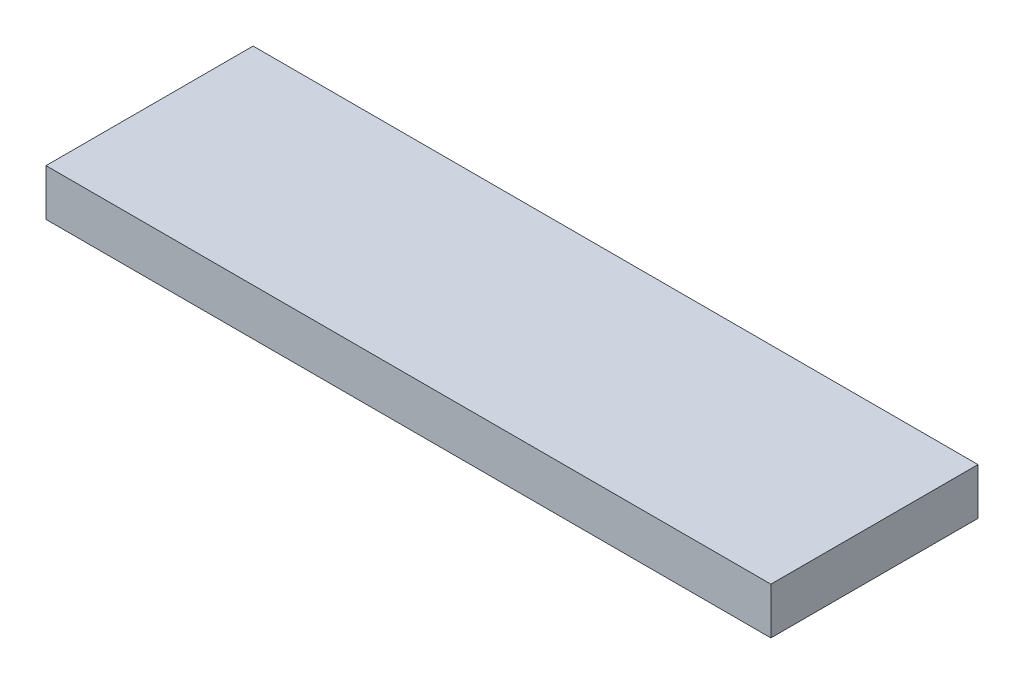
ISO-10303-21;
HEADER;
FILE_DESCRIPTION(('STEP AP214'),'2;1');
FILE_NAME('part.step','',(''),(''),'','','');
FILE_SCHEMA(('AUTOMOTIVE_DESIGN { 1 0 10303 214 1 1 1 1 }'));
ENDSEC;
DATA;
#1=APPLICATION_CONTEXT('core data for automotive mechanical design processes');
#2=APPLICATION_PROTOCOL_DEFINITION('international standard','automotive_design',2000,#1);
#3=PRODUCT_CONTEXT('',#1,'mechanical');
#4=PRODUCT('Part','Part','',(#3));
#5=PRODUCT_RELATED_PRODUCT_CATEGORY('part','',(#4));
#6=PRODUCT_DEFINITION_FORMATION('','',#4);
#7=PRODUCT_DEFINITION_CONTEXT('part definition',#1,'design');
#8=PRODUCT_DEFINITION('design','',#6,#7);
#9=PRODUCT_DEFINITION_SHAPE('','',#8);
#10=(LENGTH_UNIT() NAMED_UNIT(*) SI_UNIT(.MILLI.,.METRE.));
#11=(NAMED_UNIT(*) PLANE_ANGLE_UNIT() SI_UNIT($,.RADIAN.));
#12=(NAMED_UNIT(*) SI_UNIT($,.STERADIAN.) SOLID_ANGLE_UNIT());
#13=UNCERTAINTY_MEASURE_WITH_UNIT(LENGTH_MEASURE(1.E-05),#10,'distance_accuracy_value','');
#14=(GEOMETRIC_REPRESENTATION_CONTEXT(3) GLOBAL_UNCERTAINTY_ASSIGNED_CONTEXT((#13)) GLOBAL_UNIT_ASSIGNED_CONTEXT((#10,
#11,#12)) REPRESENTATION_CONTEXT('',''));
#15=CARTESIAN_POINT('',(0.,0.,0.));
#16=DIRECTION('',(0.,0.,1.));
#17=DIRECTION('',(1.,0.,0.));
#18=AXIS2_PLACEMENT_3D('',#15,#16,#17);
#19=CARTESIAN_POINT('',(35.,4.5,-10.));
#20=DIRECTION('',(-1.,0.,0.));
#21=DIRECTION('',(0.,0.,1.));
#22=AXIS2_PLACEMENT_3D('',#19,#20,#21);
#23=PLANE('',#22);
#24=DIRECTION('',(0.,0.,-1.));
#25=VECTOR('',#24,1.);
#26=CARTESIAN_POINT('',(35.,0.,-10.));
#27=LINE('',#26,#25);
#28=CARTESIAN_POINT('',(35.,0.,10.));
#29=VERTEX_POINT('',#28);
#30=CARTESIAN_POINT('',(35.,0.,-10.));
#31=VERTEX_POINT('',#30);
#32=EDGE_CURVE('E96',#29,#31,#27,.T.);
#33=ORIENTED_EDGE('',*,*,#32,.T.);
#34=DIRECTION('',(0.,-1.,0.));
#35=VECTOR('',#34,1.);
#36=CARTESIAN_POINT('',(35.,4.5,-10.));
#37=LINE('',#36,#35);
#38=CARTESIAN_POINT('',(35.,4.5,-10.));
#39=VERTEX_POINT('',#38);
#40=EDGE_CURVE('E11',#39,#31,#37,.T.);
#41=ORIENTED_EDGE('',*,*,#40,.F.);
#42=DIRECTION('',(0.,0.,-1.));
#43=VECTOR('',#42,1.);
#44=CARTESIAN_POINT('',(35.,4.5,-10.));
#45=LINE('',#44,#43);
#46=CARTESIAN_POINT('',(35.,4.5,10.));
#47=VERTEX_POINT('',#46);
#48=EDGE_CURVE('E84',#47,#39,#45,.T.);
#49=ORIENTED_EDGE('',*,*,#48,.F.);
#50=DIRECTION('',(0.,-1.,0.));
#51=VECTOR('',#50,1.);
#52=CARTESIAN_POINT('',(35.,4.5,10.));
#53=LINE('',#52,#51);
#54=EDGE_CURVE('E92',#47,#29,#53,.T.);
#55=ORIENTED_EDGE('',*,*,#54,.T.);
#56=EDGE_LOOP('',(#33,#41,#49,#55));
#57=FACE_BOUND('',#56,.T.);
#58=ADVANCED_FACE('F33',(#57),#23,.F.);
#59=CARTESIAN_POINT('',(-35.,4.5,-10.));
#60=DIRECTION('',(0.,0.,1.));
#61=DIRECTION('',(1.,0.,0.));
#62=AXIS2_PLACEMENT_3D('',#59,#60,#61);
#63=PLANE('',#62);
#64=DIRECTION('',(-1.,0.,0.));
#65=VECTOR('',#64,1.);
#66=CARTESIAN_POINT('',(-35.,0.,-10.));
#67=LINE('',#66,#65);
#68=CARTESIAN_POINT('',(-35.,0.,-10.));
#69=VERTEX_POINT('',#68);
#70=EDGE_CURVE('E88',#31,#69,#67,.T.);
#71=ORIENTED_EDGE('',*,*,#70,.T.);
#72=DIRECTION('',(0.,-1.,0.));
#73=VECTOR('',#72,1.);
#74=CARTESIAN_POINT('',(-35.,4.5,-10.));
#75=LINE('',#74,#73);
#76=CARTESIAN_POINT('',(-35.,4.5,-10.));
#77=VERTEX_POINT('',#76);
#78=EDGE_CURVE('E41',#77,#69,#75,.T.);
#79=ORIENTED_EDGE('',*,*,#78,.F.);
#80=DIRECTION('',(-1.,0.,0.));
#81=VECTOR('',#80,1.);
#82=CARTESIAN_POINT('',(-35.,4.5,-10.));
#83=LINE('',#82,#81);
#84=EDGE_CURVE('E79',#39,#77,#83,.T.);
#85=ORIENTED_EDGE('',*,*,#84,.F.);
#86=ORIENTED_EDGE('',*,*,#40,.T.);
#87=EDGE_LOOP('',(#71,#79,#85,#86));
#88=FACE_BOUND('',#87,.T.);
#89=ADVANCED_FACE('F87',(#88),#63,.F.);
#90=CARTESIAN_POINT('',(-35.,4.5,-10.));
#91=DIRECTION('',(1.,0.,0.));
#92=DIRECTION('',(0.,0.,-1.));
#93=AXIS2_PLACEMENT_3D('',#90,#91,#92);
#94=PLANE('',#93);
#95=DIRECTION('',(0.,0.,1.));
#96=VECTOR('',#95,1.);
#97=CARTESIAN_POINT('',(-35.,0.,-10.));
#98=LINE('',#97,#96);
#99=CARTESIAN_POINT('',(-35.,0.,10.));
#100=VERTEX_POINT('',#99);
#101=EDGE_CURVE('E66',#69,#100,#98,.T.);
#102=ORIENTED_EDGE('',*,*,#101,.T.);
#103=DIRECTION('',(0.,-1.,0.));
#104=VECTOR('',#103,1.);
#105=CARTESIAN_POINT('',(-35.,4.5,10.));
#106=LINE('',#105,#104);
#107=CARTESIAN_POINT('',(-35.,4.5,10.));
#108=VERTEX_POINT('',#107);
#109=EDGE_CURVE('E89',#108,#100,#106,.T.);
#110=ORIENTED_EDGE('',*,*,#109,.F.);
#111=DIRECTION('',(0.,0.,1.));
#112=VECTOR('',#111,1.);
#113=CARTESIAN_POINT('',(-35.,4.5,-10.));
#114=LINE('',#113,#112);
#115=EDGE_CURVE('E82',#77,#108,#114,.T.);
#116=ORIENTED_EDGE('',*,*,#115,.F.);
#117=ORIENTED_EDGE('',*,*,#78,.T.);
#118=EDGE_LOOP('',(#102,#110,#116,#117));
#119=FACE_BOUND('',#118,.T.);
#120=ADVANCED_FACE('F90',(#119),#94,.F.);
#121=CARTESIAN_POINT('',(-35.,4.5,10.));
#122=DIRECTION('',(0.,0.,-1.));
#123=DIRECTION('',(-1.,0.,0.));
#124=AXIS2_PLACEMENT_3D('',#121,#122,#123);
#125=PLANE('',#124);
#126=DIRECTION('',(1.,0.,0.));
#127=VECTOR('',#126,1.);
#128=CARTESIAN_POINT('',(-35.,0.,10.));
#129=LINE('',#128,#127);
#130=EDGE_CURVE('E72',#100,#29,#129,.T.);
#131=ORIENTED_EDGE('',*,*,#130,.T.);
#132=ORIENTED_EDGE('',*,*,#54,.F.);
#133=DIRECTION('',(1.,0.,0.));
#134=VECTOR('',#133,1.);
#135=CARTESIAN_POINT('',(-35.,4.5,10.));
#136=LINE('',#135,#134);
#137=EDGE_CURVE('E49',#108,#47,#136,.T.);
#138=ORIENTED_EDGE('',*,*,#137,.F.);
#139=ORIENTED_EDGE('',*,*,#109,.T.);
#140=EDGE_LOOP('',(#131,#132,#138,#139));
#141=FACE_BOUND('',#140,.T.);
#142=ADVANCED_FACE('F103',(#141),#125,.F.);
#143=CARTESIAN_POINT('',(0.,4.5,0.));
#144=DIRECTION('',(0.,1.,0.));
#145=DIRECTION('',(0.,0.,1.));
#146=AXIS2_PLACEMENT_3D('',#143,#144,#145);
#147=PLANE('',#146);
#148=ORIENTED_EDGE('',*,*,#48,.T.);
#149=ORIENTED_EDGE('',*,*,#84,.T.);
#150=ORIENTED_EDGE('',*,*,#115,.T.);
#151=ORIENTED_EDGE('',*,*,#137,.T.);
#152=EDGE_LOOP('',(#148,#149,#150,#151));
#153=FACE_BOUND('',#152,.T.);
#154=ADVANCED_FACE('F80',(#153),#147,.T.);
#155=CARTESIAN_POINT('',(0.,0.,0.));
#156=DIRECTION('',(0.,1.,0.));
#157=DIRECTION('',(0.,0.,1.));
#158=AXIS2_PLACEMENT_3D('',#155,#156,#157);
#159=PLANE('',#158);
#160=ORIENTED_EDGE('',*,*,#32,.F.);
#161=ORIENTED_EDGE('',*,*,#130,.F.);
#162=ORIENTED_EDGE('',*,*,#101,.F.);
#163=ORIENTED_EDGE('',*,*,#70,.F.);
#164=EDGE_LOOP('',(#160,#161,#162,#163));
#165=FACE_BOUND('',#164,.T.);
#166=ADVANCED_FACE('F106',(#165),#159,.F.);
#167=CLOSED_SHELL('',(#58,#89,#120,#142,#154,#166));
#168=MANIFOLD_SOLID_BREP('B2',#167);
#169=ADVANCED_BREP_SHAPE_REPRESENTATION('',(#18,#168),#14);
#170=SHAPE_DEFINITION_REPRESENTATION(#9,#169);
ENDSEC;
END-ISO-10303-21;
